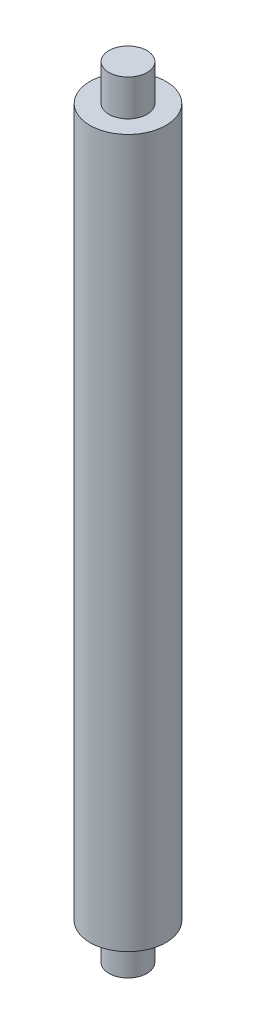
ISO-10303-21;
HEADER;
FILE_DESCRIPTION(('STEP AP214'),'2;1');
FILE_NAME('part.step','',(''),(''),'','','');
FILE_SCHEMA(('AUTOMOTIVE_DESIGN { 1 0 10303 214 1 1 1 1 }'));
ENDSEC;
DATA;
#1=APPLICATION_CONTEXT('core data for automotive mechanical design processes');
#2=APPLICATION_PROTOCOL_DEFINITION('international standard','automotive_design',2000,#1);
#3=PRODUCT_CONTEXT('',#1,'mechanical');
#4=PRODUCT('Part','Part','',(#3));
#5=PRODUCT_RELATED_PRODUCT_CATEGORY('part','',(#4));
#6=PRODUCT_DEFINITION_FORMATION('','',#4);
#7=PRODUCT_DEFINITION_CONTEXT('part definition',#1,'design');
#8=PRODUCT_DEFINITION('design','',#6,#7);
#9=PRODUCT_DEFINITION_SHAPE('','',#8);
#10=(LENGTH_UNIT() NAMED_UNIT(*) SI_UNIT(.MILLI.,.METRE.));
#11=(NAMED_UNIT(*) PLANE_ANGLE_UNIT() SI_UNIT($,.RADIAN.));
#12=(NAMED_UNIT(*) SI_UNIT($,.STERADIAN.) SOLID_ANGLE_UNIT());
#13=UNCERTAINTY_MEASURE_WITH_UNIT(LENGTH_MEASURE(1.E-05),#10,'distance_accuracy_value','');
#14=(GEOMETRIC_REPRESENTATION_CONTEXT(3) GLOBAL_UNCERTAINTY_ASSIGNED_CONTEXT((#13)) GLOBAL_UNIT_ASSIGNED_CONTEXT((#10,
#11,#12)) REPRESENTATION_CONTEXT('',''));
#15=CARTESIAN_POINT('',(0.,0.,0.));
#16=DIRECTION('',(0.,0.,1.));
#17=DIRECTION('',(1.,0.,0.));
#18=AXIS2_PLACEMENT_3D('',#15,#16,#17);
#19=CARTESIAN_POINT('',(0.,92.964,0.));
#20=DIRECTION('',(0.,-1.,0.));
#21=DIRECTION('',(0.,0.,-1.));
#22=AXIS2_PLACEMENT_3D('',#19,#20,#21);
#23=CYLINDRICAL_SURFACE('',#22,5.);
#24=CARTESIAN_POINT('',(0.,92.964,0.));
#25=DIRECTION('',(0.,1.,0.));
#26=DIRECTION('',(0.,0.,1.));
#27=AXIS2_PLACEMENT_3D('',#24,#25,#26);
#28=CIRCLE('',#27,5.);
#29=CARTESIAN_POINT('',(0.,92.964,5.));
#30=VERTEX_POINT('',#29);
#31=EDGE_CURVE('E59',#30,#30,#28,.T.);
#32=ORIENTED_EDGE('',*,*,#31,.F.);
#33=EDGE_LOOP('',(#32));
#34=FACE_BOUND('',#33,.T.);
#35=CARTESIAN_POINT('',(0.,0.,0.));
#36=DIRECTION('',(0.,1.,0.));
#37=DIRECTION('',(0.,0.,1.));
#38=AXIS2_PLACEMENT_3D('',#35,#36,#37);
#39=CIRCLE('',#38,5.);
#40=CARTESIAN_POINT('',(0.,0.,5.));
#41=VERTEX_POINT('',#40);
#42=EDGE_CURVE('E48',#41,#41,#39,.T.);
#43=ORIENTED_EDGE('',*,*,#42,.T.);
#44=EDGE_LOOP('',(#43));
#45=FACE_BOUND('',#44,.T.);
#46=ADVANCED_FACE('F45',(#34,#45),#23,.T.);
#47=CARTESIAN_POINT('',(0.,92.964,0.));
#48=DIRECTION('',(0.,1.,0.));
#49=DIRECTION('',(0.,0.,1.));
#50=AXIS2_PLACEMENT_3D('',#47,#48,#49);
#51=PLANE('',#50);
#52=CARTESIAN_POINT('',(0.,92.964,0.));
#53=DIRECTION('',(0.,1.,0.));
#54=DIRECTION('',(0.,0.,1.));
#55=AXIS2_PLACEMENT_3D('',#52,#53,#54);
#56=CIRCLE('',#55,2.5);
#57=CARTESIAN_POINT('',(0.,92.964,-2.5));
#58=VERTEX_POINT('',#57);
#59=EDGE_CURVE('E53',#58,#58,#56,.T.);
#60=ORIENTED_EDGE('',*,*,#59,.F.);
#61=EDGE_LOOP('',(#60));
#62=FACE_BOUND('',#61,.T.);
#63=ORIENTED_EDGE('',*,*,#31,.T.);
#64=EDGE_LOOP('',(#63));
#65=FACE_BOUND('',#64,.T.);
#66=ADVANCED_FACE('F79',(#62,#65),#51,.T.);
#67=CARTESIAN_POINT('',(0.,0.,0.));
#68=DIRECTION('',(0.,1.,0.));
#69=DIRECTION('',(0.,0.,1.));
#70=AXIS2_PLACEMENT_3D('',#67,#68,#69);
#71=PLANE('',#70);
#72=CARTESIAN_POINT('',(0.,0.,0.));
#73=DIRECTION('',(0.,-1.,0.));
#74=DIRECTION('',(0.,0.,-1.));
#75=AXIS2_PLACEMENT_3D('',#72,#73,#74);
#76=CIRCLE('',#75,2.5);
#77=CARTESIAN_POINT('',(0.,0.,2.5));
#78=VERTEX_POINT('',#77);
#79=EDGE_CURVE('E10',#78,#78,#76,.T.);
#80=ORIENTED_EDGE('',*,*,#79,.F.);
#81=EDGE_LOOP('',(#80));
#82=FACE_BOUND('',#81,.T.);
#83=ORIENTED_EDGE('',*,*,#42,.F.);
#84=EDGE_LOOP('',(#83));
#85=FACE_BOUND('',#84,.T.);
#86=ADVANCED_FACE('F76',(#82,#85),#71,.F.);
#87=CARTESIAN_POINT('',(0.,97.7265,0.));
#88=DIRECTION('',(0.,-1.,0.));
#89=DIRECTION('',(0.,0.,-1.));
#90=AXIS2_PLACEMENT_3D('',#87,#88,#89);
#91=CYLINDRICAL_SURFACE('',#90,2.5);
#92=CARTESIAN_POINT('',(0.,97.7265,0.));
#93=DIRECTION('',(0.,1.,0.));
#94=DIRECTION('',(0.,0.,1.));
#95=AXIS2_PLACEMENT_3D('',#92,#93,#94);
#96=CIRCLE('',#95,2.5);
#97=CARTESIAN_POINT('',(0.,97.7265,-2.5));
#98=VERTEX_POINT('',#97);
#99=EDGE_CURVE('E64',#98,#98,#96,.T.);
#100=CARTESIAN_POINT('',(0.,97.7265,-2.5));
#101=CARTESIAN_POINT('',(0.,97.676890625,-2.5));
#102=CARTESIAN_POINT('',(0.,97.62728125,-2.5));
#103=CARTESIAN_POINT('',(0.,97.5280625,-2.5));
#104=CARTESIAN_POINT('',(0.,97.478453125,-2.5));
#105=CARTESIAN_POINT('',(0.,97.379234375,-2.5));
#106=CARTESIAN_POINT('',(0.,97.329625,-2.5));
#107=CARTESIAN_POINT('',(0.,97.23040625,-2.5));
#108=CARTESIAN_POINT('',(0.,97.180796875,-2.5));
#109=CARTESIAN_POINT('',(0.,97.081578125,-2.5));
#110=CARTESIAN_POINT('',(0.,97.03196875,-2.5));
#111=CARTESIAN_POINT('',(0.,96.93275,-2.5));
#112=CARTESIAN_POINT('',(0.,96.883140625,-2.5));
#113=CARTESIAN_POINT('',(0.,96.783921875,-2.5));
#114=CARTESIAN_POINT('',(0.,96.7343125,-2.5));
#115=CARTESIAN_POINT('',(0.,96.63509375,-2.5));
#116=CARTESIAN_POINT('',(0.,96.585484375,-2.5));
#117=CARTESIAN_POINT('',(0.,96.486265625,-2.5));
#118=CARTESIAN_POINT('',(0.,96.43665625,-2.5));
#119=CARTESIAN_POINT('',(0.,96.3374375,-2.5));
#120=CARTESIAN_POINT('',(0.,96.287828125,-2.5));
#121=CARTESIAN_POINT('',(0.,96.188609375,-2.5));
#122=CARTESIAN_POINT('',(0.,96.139,-2.5));
#123=CARTESIAN_POINT('',(0.,96.03978125,-2.5));
#124=CARTESIAN_POINT('',(0.,95.990171875,-2.5));
#125=CARTESIAN_POINT('',(0.,95.890953125,-2.5));
#126=CARTESIAN_POINT('',(0.,95.84134375,-2.5));
#127=CARTESIAN_POINT('',(0.,95.742125,-2.5));
#128=CARTESIAN_POINT('',(0.,95.692515625,-2.5));
#129=CARTESIAN_POINT('',(0.,95.593296875,-2.5));
#130=CARTESIAN_POINT('',(0.,95.5436875,-2.5));
#131=CARTESIAN_POINT('',(0.,95.44446875,-2.5));
#132=CARTESIAN_POINT('',(0.,95.394859375,-2.5));
#133=CARTESIAN_POINT('',(0.,95.295640625,-2.5));
#134=CARTESIAN_POINT('',(0.,95.24603125,-2.5));
#135=CARTESIAN_POINT('',(0.,95.1468125,-2.5));
#136=CARTESIAN_POINT('',(0.,95.097203125,-2.5));
#137=CARTESIAN_POINT('',(0.,94.997984375,-2.5));
#138=CARTESIAN_POINT('',(0.,94.948375,-2.5));
#139=CARTESIAN_POINT('',(0.,94.84915625,-2.5));
#140=CARTESIAN_POINT('',(0.,94.799546875,-2.5));
#141=CARTESIAN_POINT('',(0.,94.700328125,-2.5));
#142=CARTESIAN_POINT('',(0.,94.65071875,-2.5));
#143=CARTESIAN_POINT('',(0.,94.5515,-2.5));
#144=CARTESIAN_POINT('',(0.,94.501890625,-2.5));
#145=CARTESIAN_POINT('',(0.,94.402671875,-2.5));
#146=CARTESIAN_POINT('',(0.,94.3530625,-2.5));
#147=CARTESIAN_POINT('',(0.,94.25384375,-2.5));
#148=CARTESIAN_POINT('',(0.,94.204234375,-2.5));
#149=CARTESIAN_POINT('',(0.,94.105015625,-2.5));
#150=CARTESIAN_POINT('',(0.,94.05540625,-2.5));
#151=CARTESIAN_POINT('',(0.,93.9561875,-2.5));
#152=CARTESIAN_POINT('',(0.,93.906578125,-2.5));
#153=CARTESIAN_POINT('',(0.,93.807359375,-2.5));
#154=CARTESIAN_POINT('',(0.,93.75775,-2.5));
#155=CARTESIAN_POINT('',(0.,93.65853125,-2.5));
#156=CARTESIAN_POINT('',(0.,93.608921875,-2.5));
#157=CARTESIAN_POINT('',(0.,93.509703125,-2.5));
#158=CARTESIAN_POINT('',(0.,93.46009375,-2.5));
#159=CARTESIAN_POINT('',(0.,93.360875,-2.5));
#160=CARTESIAN_POINT('',(0.,93.311265625,-2.5));
#161=CARTESIAN_POINT('',(0.,93.212046875,-2.5));
#162=CARTESIAN_POINT('',(0.,93.1624375,-2.5));
#163=CARTESIAN_POINT('',(0.,93.06321875,-2.5));
#164=CARTESIAN_POINT('',(0.,93.013609375,-2.5));
#165=CARTESIAN_POINT('',(0.,92.964,-2.5));
#166=B_SPLINE_CURVE_WITH_KNOTS('',3,(#100,#101,#102,#103,#104,#105,#106,#107,#108,#109,#110,
#111,#112,#113,#114,#115,#116,#117,#118,#119,#120,#121,#122,#123,#124,#125,#126,#127,#128,#129,
#130,#131,#132,#133,#134,#135,#136,#137,#138,#139,#140,#141,#142,#143,#144,#145,#146,#147,#148,
#149,#150,#151,#152,#153,#154,#155,#156,#157,#158,#159,#160,#161,#162,#163,#164,#165),
.UNSPECIFIED.,.F.,.F.,(4,2,2,2,2,2,2,2,2,2,2,2,2,2,2,2,2,2,2,2,2,2,2,2,2,2,2,2,2,2,2,2,4),(0.,
0.148828125,0.29765625,0.446484375,0.5953125,0.744140625,0.892968750000001,1.041796875,1.190625,
1.339453125,1.48828125,1.637109375,1.7859375,1.934765625,2.08359375,2.232421875,2.38125,
2.530078125,2.67890625,2.827734375,2.9765625,3.125390625,3.27421875,3.423046875,3.571875,
3.720703125,3.86953125,4.018359375,4.1671875,4.316015625,4.46484375,4.613671875,4.7625),.UNSPECIFIED.);
#167=EDGE_CURVE('BSEAM78',#98,#58,#166,.T.);
#168=ORIENTED_EDGE('',*,*,#99,.F.);
#169=ORIENTED_EDGE('',*,*,#59,.T.);
#170=ORIENTED_EDGE('',*,*,#167,.T.);
#171=ORIENTED_EDGE('',*,*,#167,.F.);
#172=EDGE_LOOP('',(#168,#170,#169,#171));
#173=FACE_BOUND('',#172,.T.);
#174=ADVANCED_FACE('F78',(#173),#91,.T.);
#175=CARTESIAN_POINT('',(0.,97.7265,0.));
#176=DIRECTION('',(0.,1.,0.));
#177=DIRECTION('',(0.,0.,1.));
#178=AXIS2_PLACEMENT_3D('',#175,#176,#177);
#179=PLANE('',#178);
#180=ORIENTED_EDGE('',*,*,#99,.T.);
#181=EDGE_LOOP('',(#180));
#182=FACE_BOUND('',#181,.T.);
#183=ADVANCED_FACE('F86',(#182),#179,.T.);
#184=CARTESIAN_POINT('',(0.,-4.7625,0.));
#185=DIRECTION('',(0.,1.,0.));
#186=DIRECTION('',(0.,0.,1.));
#187=AXIS2_PLACEMENT_3D('',#184,#185,#186);
#188=CYLINDRICAL_SURFACE('',#187,2.5);
#189=CARTESIAN_POINT('',(0.,-4.7625,0.));
#190=DIRECTION('',(0.,-1.,0.));
#191=DIRECTION('',(0.,0.,-1.));
#192=AXIS2_PLACEMENT_3D('',#189,#190,#191);
#193=CIRCLE('',#192,2.5);
#194=CARTESIAN_POINT('',(0.,-4.7625,2.5));
#195=VERTEX_POINT('',#194);
#196=EDGE_CURVE('E63',#195,#195,#193,.T.);
#197=CARTESIAN_POINT('',(0.,-4.7625,2.5));
#198=CARTESIAN_POINT('',(0.,-4.712890625,2.5));
#199=CARTESIAN_POINT('',(0.,-4.66328125,2.5));
#200=CARTESIAN_POINT('',(0.,-4.5640625,2.5));
#201=CARTESIAN_POINT('',(0.,-4.514453125,2.5));
#202=CARTESIAN_POINT('',(0.,-4.415234375,2.5));
#203=CARTESIAN_POINT('',(0.,-4.365625,2.5));
#204=CARTESIAN_POINT('',(0.,-4.26640625,2.5));
#205=CARTESIAN_POINT('',(0.,-4.216796875,2.5));
#206=CARTESIAN_POINT('',(0.,-4.117578125,2.5));
#207=CARTESIAN_POINT('',(0.,-4.06796875,2.5));
#208=CARTESIAN_POINT('',(0.,-3.96875,2.5));
#209=CARTESIAN_POINT('',(0.,-3.919140625,2.5));
#210=CARTESIAN_POINT('',(0.,-3.819921875,2.5));
#211=CARTESIAN_POINT('',(0.,-3.7703125,2.5));
#212=CARTESIAN_POINT('',(0.,-3.67109375,2.5));
#213=CARTESIAN_POINT('',(0.,-3.621484375,2.5));
#214=CARTESIAN_POINT('',(0.,-3.522265625,2.5));
#215=CARTESIAN_POINT('',(0.,-3.47265625,2.5));
#216=CARTESIAN_POINT('',(0.,-3.3734375,2.5));
#217=CARTESIAN_POINT('',(0.,-3.323828125,2.5));
#218=CARTESIAN_POINT('',(0.,-3.224609375,2.5));
#219=CARTESIAN_POINT('',(0.,-3.175,2.5));
#220=CARTESIAN_POINT('',(0.,-3.07578125,2.5));
#221=CARTESIAN_POINT('',(0.,-3.026171875,2.5));
#222=CARTESIAN_POINT('',(0.,-2.926953125,2.5));
#223=CARTESIAN_POINT('',(0.,-2.87734375,2.5));
#224=CARTESIAN_POINT('',(0.,-2.778125,2.5));
#225=CARTESIAN_POINT('',(0.,-2.728515625,2.5));
#226=CARTESIAN_POINT('',(0.,-2.629296875,2.5));
#227=CARTESIAN_POINT('',(0.,-2.5796875,2.5));
#228=CARTESIAN_POINT('',(0.,-2.48046875,2.5));
#229=CARTESIAN_POINT('',(0.,-2.430859375,2.5));
#230=CARTESIAN_POINT('',(0.,-2.331640625,2.5));
#231=CARTESIAN_POINT('',(0.,-2.28203125,2.5));
#232=CARTESIAN_POINT('',(0.,-2.1828125,2.5));
#233=CARTESIAN_POINT('',(0.,-2.133203125,2.5));
#234=CARTESIAN_POINT('',(0.,-2.033984375,2.5));
#235=CARTESIAN_POINT('',(0.,-1.984375,2.5));
#236=CARTESIAN_POINT('',(0.,-1.88515625,2.5));
#237=CARTESIAN_POINT('',(0.,-1.835546875,2.5));
#238=CARTESIAN_POINT('',(0.,-1.736328125,2.5));
#239=CARTESIAN_POINT('',(0.,-1.68671875,2.5));
#240=CARTESIAN_POINT('',(0.,-1.5875,2.5));
#241=CARTESIAN_POINT('',(0.,-1.537890625,2.5));
#242=CARTESIAN_POINT('',(0.,-1.438671875,2.5));
#243=CARTESIAN_POINT('',(0.,-1.3890625,2.5));
#244=CARTESIAN_POINT('',(0.,-1.28984375,2.5));
#245=CARTESIAN_POINT('',(0.,-1.240234375,2.5));
#246=CARTESIAN_POINT('',(0.,-1.141015625,2.5));
#247=CARTESIAN_POINT('',(0.,-1.09140625,2.5));
#248=CARTESIAN_POINT('',(0.,-0.992187499999999,2.5));
#249=CARTESIAN_POINT('',(0.,-0.942578124999999,2.5));
#250=CARTESIAN_POINT('',(0.,-0.843359375,2.5));
#251=CARTESIAN_POINT('',(0.,-0.79375,2.5));
#252=CARTESIAN_POINT('',(0.,-0.69453125,2.5));
#253=CARTESIAN_POINT('',(0.,-0.644921875,2.5));
#254=CARTESIAN_POINT('',(0.,-0.545703125,2.5));
#255=CARTESIAN_POINT('',(0.,-0.49609375,2.5));
#256=CARTESIAN_POINT('',(0.,-0.396875,2.5));
#257=CARTESIAN_POINT('',(0.,-0.347265625,2.5));
#258=CARTESIAN_POINT('',(0.,-0.248046875,2.5));
#259=CARTESIAN_POINT('',(0.,-0.1984375,2.5));
#260=CARTESIAN_POINT('',(0.,-0.09921875,2.5));
#261=CARTESIAN_POINT('',(0.,-0.049609375,2.5));
#262=CARTESIAN_POINT('',(0.,0.,2.5));
#263=B_SPLINE_CURVE_WITH_KNOTS('',3,(#197,#198,#199,#200,#201,#202,#203,#204,#205,#206,#207,
#208,#209,#210,#211,#212,#213,#214,#215,#216,#217,#218,#219,#220,#221,#222,#223,#224,#225,#226,
#227,#228,#229,#230,#231,#232,#233,#234,#235,#236,#237,#238,#239,#240,#241,#242,#243,#244,#245,
#246,#247,#248,#249,#250,#251,#252,#253,#254,#255,#256,#257,#258,#259,#260,#261,#262),
.UNSPECIFIED.,.F.,.F.,(4,2,2,2,2,2,2,2,2,2,2,2,2,2,2,2,2,2,2,2,2,2,2,2,2,2,2,2,2,2,2,2,4),(0.,
0.148828125,0.29765625,0.446484375,0.5953125,0.744140625,0.892968750000001,1.041796875,1.190625,
1.339453125,1.48828125,1.637109375,1.7859375,1.934765625,2.08359375,2.232421875,2.38125,
2.530078125,2.67890625,2.827734375,2.9765625,3.125390625,3.27421875,3.423046875,3.571875,
3.720703125,3.86953125,4.018359375,4.1671875,4.316015625,4.46484375,4.613671875,4.7625),.UNSPECIFIED.);
#264=EDGE_CURVE('BSEAM111',#195,#78,#263,.T.);
#265=ORIENTED_EDGE('',*,*,#196,.F.);
#266=ORIENTED_EDGE('',*,*,#79,.T.);
#267=ORIENTED_EDGE('',*,*,#264,.T.);
#268=ORIENTED_EDGE('',*,*,#264,.F.);
#269=EDGE_LOOP('',(#265,#267,#266,#268));
#270=FACE_BOUND('',#269,.T.);
#271=ADVANCED_FACE('F111',(#270),#188,.T.);
#272=CARTESIAN_POINT('',(0.,-4.7625,0.));
#273=DIRECTION('',(0.,-1.,0.));
#274=DIRECTION('',(0.,0.,-1.));
#275=AXIS2_PLACEMENT_3D('',#272,#273,#274);
#276=PLANE('',#275);
#277=ORIENTED_EDGE('',*,*,#196,.T.);
#278=EDGE_LOOP('',(#277));
#279=FACE_BOUND('',#278,.T.);
#280=ADVANCED_FACE('F123',(#279),#276,.T.);
#281=CLOSED_SHELL('',(#46,#66,#86,#174,#183,#271,#280));
#282=MANIFOLD_SOLID_BREP('B2',#281);
#283=ADVANCED_BREP_SHAPE_REPRESENTATION('',(#18,#282),#14);
#284=SHAPE_DEFINITION_REPRESENTATION(#9,#283);
ENDSEC;
END-ISO-10303-21;
